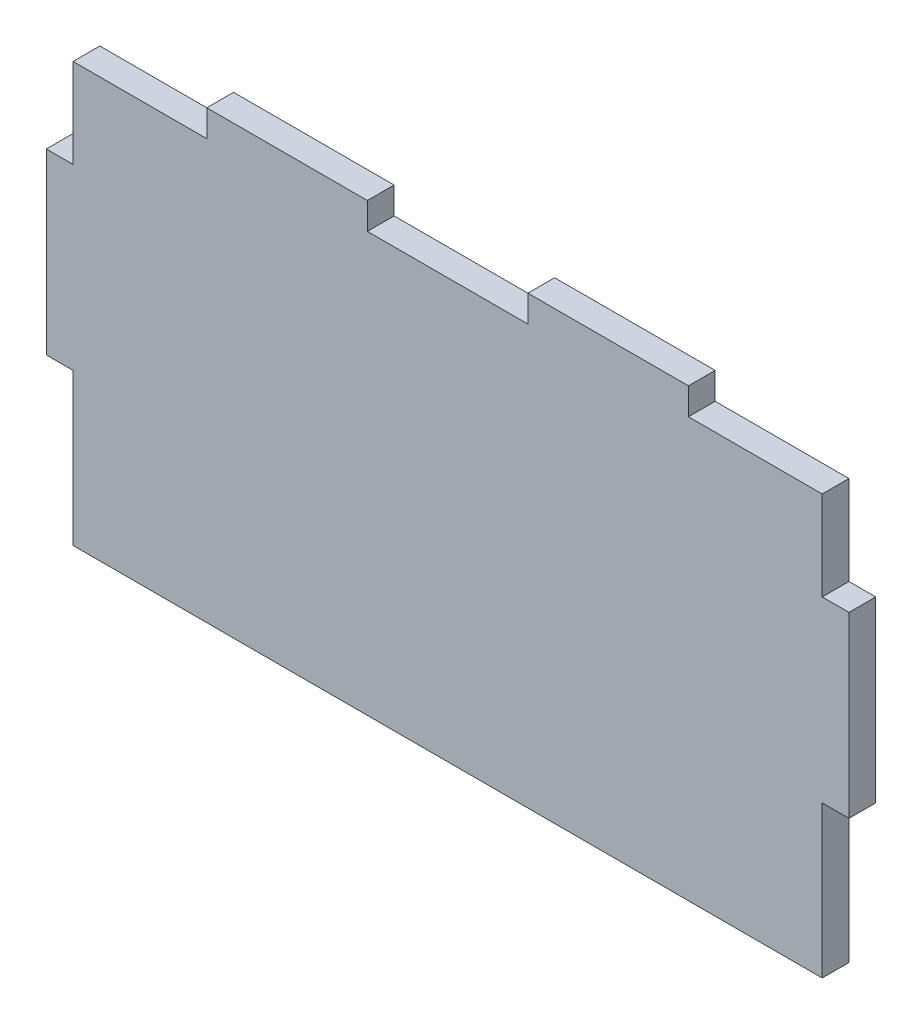
ISO-10303-21;
HEADER;
FILE_DESCRIPTION(('STEP AP214'),'2;1');
FILE_NAME('part.step','',(''),(''),'','','');
FILE_SCHEMA(('AUTOMOTIVE_DESIGN { 1 0 10303 214 1 1 1 1 }'));
ENDSEC;
DATA;
#1=APPLICATION_CONTEXT('core data for automotive mechanical design processes');
#2=APPLICATION_PROTOCOL_DEFINITION('international standard','automotive_design',2000,#1);
#3=PRODUCT_CONTEXT('',#1,'mechanical');
#4=PRODUCT('Part','Part','',(#3));
#5=PRODUCT_RELATED_PRODUCT_CATEGORY('part','',(#4));
#6=PRODUCT_DEFINITION_FORMATION('','',#4);
#7=PRODUCT_DEFINITION_CONTEXT('part definition',#1,'design');
#8=PRODUCT_DEFINITION('design','',#6,#7);
#9=PRODUCT_DEFINITION_SHAPE('','',#8);
#10=(LENGTH_UNIT() NAMED_UNIT(*) SI_UNIT(.MILLI.,.METRE.));
#11=(NAMED_UNIT(*) PLANE_ANGLE_UNIT() SI_UNIT($,.RADIAN.));
#12=(NAMED_UNIT(*) SI_UNIT($,.STERADIAN.) SOLID_ANGLE_UNIT());
#13=UNCERTAINTY_MEASURE_WITH_UNIT(LENGTH_MEASURE(1.E-05),#10,'distance_accuracy_value','');
#14=(GEOMETRIC_REPRESENTATION_CONTEXT(3) GLOBAL_UNCERTAINTY_ASSIGNED_CONTEXT((#13)) GLOBAL_UNIT_ASSIGNED_CONTEXT((#10,
#11,#12)) REPRESENTATION_CONTEXT('',''));
#15=CARTESIAN_POINT('',(0.,0.,0.));
#16=DIRECTION('',(0.,0.,1.));
#17=DIRECTION('',(1.,0.,0.));
#18=AXIS2_PLACEMENT_3D('',#15,#16,#17);
#19=CARTESIAN_POINT('',(0.,50.,3.));
#20=DIRECTION('',(0.,-1.,0.));
#21=DIRECTION('',(0.,0.,-1.));
#22=AXIS2_PLACEMENT_3D('',#19,#20,#21);
#23=PLANE('',#22);
#24=DIRECTION('',(-1.,0.,0.));
#25=VECTOR('',#24,1.);
#26=CARTESIAN_POINT('',(0.,50.,3.));
#27=LINE('',#26,#25);
#28=CARTESIAN_POINT('',(36.,50.,3.));
#29=VERTEX_POINT('',#28);
#30=CARTESIAN_POINT('',(18.,50.,3.));
#31=VERTEX_POINT('',#30);
#32=EDGE_CURVE('E42',#29,#31,#27,.T.);
#33=ORIENTED_EDGE('',*,*,#32,.F.);
#34=DIRECTION('',(0.,0.,1.));
#35=VECTOR('',#34,1.);
#36=CARTESIAN_POINT('',(36.,50.,0.));
#37=LINE('',#36,#35);
#38=CARTESIAN_POINT('',(36.,50.,0.));
#39=VERTEX_POINT('',#38);
#40=EDGE_CURVE('E201',#39,#29,#37,.T.);
#41=ORIENTED_EDGE('',*,*,#40,.F.);
#42=DIRECTION('',(-1.,0.,0.));
#43=VECTOR('',#42,1.);
#44=CARTESIAN_POINT('',(0.,50.,0.));
#45=LINE('',#44,#43);
#46=CARTESIAN_POINT('',(18.,50.,0.));
#47=VERTEX_POINT('',#46);
#48=EDGE_CURVE('E37',#39,#47,#45,.T.);
#49=ORIENTED_EDGE('',*,*,#48,.T.);
#50=DIRECTION('',(0.,0.,1.));
#51=VECTOR('',#50,1.);
#52=CARTESIAN_POINT('',(18.,50.,0.));
#53=LINE('',#52,#51);
#54=EDGE_CURVE('E298',#47,#31,#53,.T.);
#55=ORIENTED_EDGE('',*,*,#54,.T.);
#56=EDGE_LOOP('',(#33,#41,#49,#55));
#57=FACE_BOUND('',#56,.T.);
#58=ADVANCED_FACE('F33',(#57),#23,.F.);
#59=CARTESIAN_POINT('',(0.,0.,3.));
#60=DIRECTION('',(1.,0.,0.));
#61=DIRECTION('',(0.,0.,-1.));
#62=AXIS2_PLACEMENT_3D('',#59,#60,#61);
#63=PLANE('',#62);
#64=DIRECTION('',(0.,-1.,0.));
#65=VECTOR('',#64,1.);
#66=CARTESIAN_POINT('',(0.,0.,0.));
#67=LINE('',#66,#65);
#68=CARTESIAN_POINT('',(0.,37.,0.));
#69=VERTEX_POINT('',#68);
#70=CARTESIAN_POINT('',(0.,17.,0.));
#71=VERTEX_POINT('',#70);
#72=EDGE_CURVE('E301',#69,#71,#67,.T.);
#73=ORIENTED_EDGE('',*,*,#72,.T.);
#74=DIRECTION('',(0.,0.,1.));
#75=VECTOR('',#74,1.);
#76=CARTESIAN_POINT('',(0.,17.,0.));
#77=LINE('',#76,#75);
#78=CARTESIAN_POINT('',(0.,17.,3.));
#79=VERTEX_POINT('',#78);
#80=EDGE_CURVE('E251',#71,#79,#77,.T.);
#81=ORIENTED_EDGE('',*,*,#80,.T.);
#82=DIRECTION('',(0.,-1.,0.));
#83=VECTOR('',#82,1.);
#84=CARTESIAN_POINT('',(0.,0.,3.));
#85=LINE('',#84,#83);
#86=CARTESIAN_POINT('',(0.,37.,3.));
#87=VERTEX_POINT('',#86);
#88=EDGE_CURVE('E309',#87,#79,#85,.T.);
#89=ORIENTED_EDGE('',*,*,#88,.F.);
#90=DIRECTION('',(0.,0.,1.));
#91=VECTOR('',#90,1.);
#92=CARTESIAN_POINT('',(0.,37.,0.));
#93=LINE('',#92,#91);
#94=EDGE_CURVE('E287',#69,#87,#93,.T.);
#95=ORIENTED_EDGE('',*,*,#94,.F.);
#96=EDGE_LOOP('',(#73,#81,#89,#95));
#97=FACE_BOUND('',#96,.T.);
#98=ADVANCED_FACE('F35',(#97),#63,.F.);
#99=CARTESIAN_POINT('',(0.,0.,3.));
#100=DIRECTION('',(0.,1.,0.));
#101=DIRECTION('',(0.,0.,1.));
#102=AXIS2_PLACEMENT_3D('',#99,#100,#101);
#103=PLANE('',#102);
#104=DIRECTION('',(1.,0.,0.));
#105=VECTOR('',#104,1.);
#106=CARTESIAN_POINT('',(0.,0.,0.));
#107=LINE('',#106,#105);
#108=CARTESIAN_POINT('',(3.,0.,0.));
#109=VERTEX_POINT('',#108);
#110=CARTESIAN_POINT('',(87.,0.,0.));
#111=VERTEX_POINT('',#110);
#112=EDGE_CURVE('E321',#109,#111,#107,.T.);
#113=ORIENTED_EDGE('',*,*,#112,.T.);
#114=DIRECTION('',(0.,0.,1.));
#115=VECTOR('',#114,1.);
#116=CARTESIAN_POINT('',(87.,0.,0.));
#117=LINE('',#116,#115);
#118=CARTESIAN_POINT('',(87.,0.,3.));
#119=VERTEX_POINT('',#118);
#120=EDGE_CURVE('E224',#111,#119,#117,.T.);
#121=ORIENTED_EDGE('',*,*,#120,.T.);
#122=DIRECTION('',(1.,0.,0.));
#123=VECTOR('',#122,1.);
#124=CARTESIAN_POINT('',(0.,0.,3.));
#125=LINE('',#124,#123);
#126=CARTESIAN_POINT('',(3.,0.,3.));
#127=VERTEX_POINT('',#126);
#128=EDGE_CURVE('E312',#127,#119,#125,.T.);
#129=ORIENTED_EDGE('',*,*,#128,.F.);
#130=DIRECTION('',(0.,0.,1.));
#131=VECTOR('',#130,1.);
#132=CARTESIAN_POINT('',(3.,0.,0.));
#133=LINE('',#132,#131);
#134=EDGE_CURVE('E265',#109,#127,#133,.T.);
#135=ORIENTED_EDGE('',*,*,#134,.F.);
#136=EDGE_LOOP('',(#113,#121,#129,#135));
#137=FACE_BOUND('',#136,.T.);
#138=ADVANCED_FACE('F362',(#137),#103,.F.);
#139=CARTESIAN_POINT('',(90.,0.,3.));
#140=DIRECTION('',(-1.,0.,0.));
#141=DIRECTION('',(0.,0.,1.));
#142=AXIS2_PLACEMENT_3D('',#139,#140,#141);
#143=PLANE('',#142);
#144=DIRECTION('',(0.,1.,0.));
#145=VECTOR('',#144,1.);
#146=CARTESIAN_POINT('',(90.,0.,0.));
#147=LINE('',#146,#145);
#148=CARTESIAN_POINT('',(90.,17.,0.));
#149=VERTEX_POINT('',#148);
#150=CARTESIAN_POINT('',(90.,37.,0.));
#151=VERTEX_POINT('',#150);
#152=EDGE_CURVE('E323',#149,#151,#147,.T.);
#153=ORIENTED_EDGE('',*,*,#152,.T.);
#154=DIRECTION('',(0.,0.,1.));
#155=VECTOR('',#154,1.);
#156=CARTESIAN_POINT('',(90.,37.,0.));
#157=LINE('',#156,#155);
#158=CARTESIAN_POINT('',(90.,37.,3.));
#159=VERTEX_POINT('',#158);
#160=EDGE_CURVE('E199',#151,#159,#157,.T.);
#161=ORIENTED_EDGE('',*,*,#160,.T.);
#162=DIRECTION('',(0.,1.,0.));
#163=VECTOR('',#162,1.);
#164=CARTESIAN_POINT('',(90.,0.,3.));
#165=LINE('',#164,#163);
#166=CARTESIAN_POINT('',(90.,17.,3.));
#167=VERTEX_POINT('',#166);
#168=EDGE_CURVE('E316',#167,#159,#165,.T.);
#169=ORIENTED_EDGE('',*,*,#168,.F.);
#170=DIRECTION('',(0.,0.,1.));
#171=VECTOR('',#170,1.);
#172=CARTESIAN_POINT('',(90.,17.,0.));
#173=LINE('',#172,#171);
#174=EDGE_CURVE('E247',#149,#167,#173,.T.);
#175=ORIENTED_EDGE('',*,*,#174,.F.);
#176=EDGE_LOOP('',(#153,#161,#169,#175));
#177=FACE_BOUND('',#176,.T.);
#178=ADVANCED_FACE('F352',(#177),#143,.F.);
#179=CARTESIAN_POINT('',(72.,50.,0.));
#180=VERTEX_POINT('',#179);
#181=CARTESIAN_POINT('',(54.,50.,0.));
#182=VERTEX_POINT('',#181);
#183=EDGE_CURVE('E313',#180,#182,#45,.T.);
#184=ORIENTED_EDGE('',*,*,#183,.T.);
#185=DIRECTION('',(0.,0.,1.));
#186=VECTOR('',#185,1.);
#187=CARTESIAN_POINT('',(54.,50.,0.));
#188=LINE('',#187,#186);
#189=CARTESIAN_POINT('',(54.,50.,3.));
#190=VERTEX_POINT('',#189);
#191=EDGE_CURVE('E204',#182,#190,#188,.T.);
#192=ORIENTED_EDGE('',*,*,#191,.T.);
#193=CARTESIAN_POINT('',(72.,50.,3.));
#194=VERTEX_POINT('',#193);
#195=EDGE_CURVE('E11',#194,#190,#27,.T.);
#196=ORIENTED_EDGE('',*,*,#195,.F.);
#197=DIRECTION('',(0.,0.,1.));
#198=VECTOR('',#197,1.);
#199=CARTESIAN_POINT('',(72.,50.,0.));
#200=LINE('',#199,#198);
#201=EDGE_CURVE('E219',#180,#194,#200,.T.);
#202=ORIENTED_EDGE('',*,*,#201,.F.);
#203=EDGE_LOOP('',(#184,#192,#196,#202));
#204=FACE_BOUND('',#203,.T.);
#205=ADVANCED_FACE('F334',(#204),#23,.F.);
#206=CARTESIAN_POINT('',(0.,0.,3.));
#207=DIRECTION('',(0.,0.,-1.));
#208=DIRECTION('',(-1.,0.,0.));
#209=AXIS2_PLACEMENT_3D('',#206,#207,#208);
#210=PLANE('',#209);
#211=DIRECTION('',(1.,0.,0.));
#212=VECTOR('',#211,1.);
#213=CARTESIAN_POINT('',(36.,47.,3.));
#214=LINE('',#213,#212);
#215=CARTESIAN_POINT('',(36.,47.,3.));
#216=VERTEX_POINT('',#215);
#217=CARTESIAN_POINT('',(54.,47.,3.));
#218=VERTEX_POINT('',#217);
#219=EDGE_CURVE('E194',#216,#218,#214,.T.);
#220=ORIENTED_EDGE('',*,*,#219,.F.);
#221=DIRECTION('',(0.,-1.,0.));
#222=VECTOR('',#221,1.);
#223=CARTESIAN_POINT('',(36.,50.,3.));
#224=LINE('',#223,#222);
#225=EDGE_CURVE('E178',#29,#216,#224,.T.);
#226=ORIENTED_EDGE('',*,*,#225,.F.);
#227=ORIENTED_EDGE('',*,*,#32,.T.);
#228=DIRECTION('',(0.,1.,0.));
#229=VECTOR('',#228,1.);
#230=CARTESIAN_POINT('',(18.,50.,3.));
#231=LINE('',#230,#229);
#232=CARTESIAN_POINT('',(18.,47.,3.));
#233=VERTEX_POINT('',#232);
#234=EDGE_CURVE('E279',#233,#31,#231,.T.);
#235=ORIENTED_EDGE('',*,*,#234,.F.);
#236=DIRECTION('',(1.,0.,0.));
#237=VECTOR('',#236,1.);
#238=CARTESIAN_POINT('',(18.,47.,3.));
#239=LINE('',#238,#237);
#240=CARTESIAN_POINT('',(3.,47.,3.));
#241=VERTEX_POINT('',#240);
#242=EDGE_CURVE('E293',#241,#233,#239,.T.);
#243=ORIENTED_EDGE('',*,*,#242,.F.);
#244=DIRECTION('',(0.,1.,0.));
#245=VECTOR('',#244,1.);
#246=CARTESIAN_POINT('',(3.,47.,3.));
#247=LINE('',#246,#245);
#248=CARTESIAN_POINT('',(3.,37.,3.));
#249=VERTEX_POINT('',#248);
#250=EDGE_CURVE('E290',#249,#241,#247,.T.);
#251=ORIENTED_EDGE('',*,*,#250,.F.);
#252=DIRECTION('',(1.,0.,0.));
#253=VECTOR('',#252,1.);
#254=CARTESIAN_POINT('',(0.,37.,3.));
#255=LINE('',#254,#253);
#256=EDGE_CURVE('E203',#87,#249,#255,.T.);
#257=ORIENTED_EDGE('',*,*,#256,.F.);
#258=ORIENTED_EDGE('',*,*,#88,.T.);
#259=DIRECTION('',(-1.,0.,0.));
#260=VECTOR('',#259,1.);
#261=CARTESIAN_POINT('',(0.,17.,3.));
#262=LINE('',#261,#260);
#263=CARTESIAN_POINT('',(3.,17.,3.));
#264=VERTEX_POINT('',#263);
#265=EDGE_CURVE('E262',#264,#79,#262,.T.);
#266=ORIENTED_EDGE('',*,*,#265,.F.);
#267=DIRECTION('',(0.,1.,0.));
#268=VECTOR('',#267,1.);
#269=CARTESIAN_POINT('',(3.,0.,3.));
#270=LINE('',#269,#268);
#271=EDGE_CURVE('E266',#127,#264,#270,.T.);
#272=ORIENTED_EDGE('',*,*,#271,.F.);
#273=ORIENTED_EDGE('',*,*,#128,.T.);
#274=DIRECTION('',(0.,-1.,0.));
#275=VECTOR('',#274,1.);
#276=CARTESIAN_POINT('',(87.,17.,3.));
#277=LINE('',#276,#275);
#278=CARTESIAN_POINT('',(87.,17.,3.));
#279=VERTEX_POINT('',#278);
#280=EDGE_CURVE('E244',#279,#119,#277,.T.);
#281=ORIENTED_EDGE('',*,*,#280,.F.);
#282=DIRECTION('',(-1.,0.,0.));
#283=VECTOR('',#282,1.);
#284=CARTESIAN_POINT('',(90.,17.,3.));
#285=LINE('',#284,#283);
#286=EDGE_CURVE('E248',#167,#279,#285,.T.);
#287=ORIENTED_EDGE('',*,*,#286,.F.);
#288=ORIENTED_EDGE('',*,*,#168,.T.);
#289=DIRECTION('',(1.,0.,0.));
#290=VECTOR('',#289,1.);
#291=CARTESIAN_POINT('',(90.,37.,3.));
#292=LINE('',#291,#290);
#293=CARTESIAN_POINT('',(87.,37.,3.));
#294=VERTEX_POINT('',#293);
#295=EDGE_CURVE('E211',#294,#159,#292,.T.);
#296=ORIENTED_EDGE('',*,*,#295,.F.);
#297=DIRECTION('',(0.,-1.,0.));
#298=VECTOR('',#297,1.);
#299=CARTESIAN_POINT('',(87.,37.,3.));
#300=LINE('',#299,#298);
#301=CARTESIAN_POINT('',(87.,47.,3.));
#302=VERTEX_POINT('',#301);
#303=EDGE_CURVE('E227',#302,#294,#300,.T.);
#304=ORIENTED_EDGE('',*,*,#303,.F.);
#305=DIRECTION('',(1.,0.,0.));
#306=VECTOR('',#305,1.);
#307=CARTESIAN_POINT('',(72.,47.,3.));
#308=LINE('',#307,#306);
#309=CARTESIAN_POINT('',(72.,47.,3.));
#310=VERTEX_POINT('',#309);
#311=EDGE_CURVE('E223',#310,#302,#308,.T.);
#312=ORIENTED_EDGE('',*,*,#311,.F.);
#313=DIRECTION('',(0.,-1.,0.));
#314=VECTOR('',#313,1.);
#315=CARTESIAN_POINT('',(72.,50.,3.));
#316=LINE('',#315,#314);
#317=EDGE_CURVE('E220',#194,#310,#316,.T.);
#318=ORIENTED_EDGE('',*,*,#317,.F.);
#319=ORIENTED_EDGE('',*,*,#195,.T.);
#320=DIRECTION('',(0.,1.,0.));
#321=VECTOR('',#320,1.);
#322=CARTESIAN_POINT('',(54.,50.,3.));
#323=LINE('',#322,#321);
#324=EDGE_CURVE('E192',#218,#190,#323,.T.);
#325=ORIENTED_EDGE('',*,*,#324,.F.);
#326=EDGE_LOOP('',(#220,#226,#227,#235,#243,#251,#257,#258,#266,#272,#273,#281,#287,#288,#296,
#304,#312,#318,#319,#325));
#327=FACE_BOUND('',#326,.T.);
#328=ADVANCED_FACE('F345',(#327),#210,.F.);
#329=CARTESIAN_POINT('',(0.,0.,0.));
#330=DIRECTION('',(0.,0.,-1.));
#331=DIRECTION('',(-1.,0.,0.));
#332=AXIS2_PLACEMENT_3D('',#329,#330,#331);
#333=PLANE('',#332);
#334=DIRECTION('',(0.,-1.,0.));
#335=VECTOR('',#334,1.);
#336=CARTESIAN_POINT('',(36.,50.,0.));
#337=LINE('',#336,#335);
#338=CARTESIAN_POINT('',(36.,47.,0.));
#339=VERTEX_POINT('',#338);
#340=EDGE_CURVE('E175',#39,#339,#337,.T.);
#341=ORIENTED_EDGE('',*,*,#340,.T.);
#342=DIRECTION('',(1.,0.,0.));
#343=VECTOR('',#342,1.);
#344=CARTESIAN_POINT('',(36.,47.,0.));
#345=LINE('',#344,#343);
#346=CARTESIAN_POINT('',(54.,47.,0.));
#347=VERTEX_POINT('',#346);
#348=EDGE_CURVE('E185',#339,#347,#345,.T.);
#349=ORIENTED_EDGE('',*,*,#348,.T.);
#350=DIRECTION('',(0.,1.,0.));
#351=VECTOR('',#350,1.);
#352=CARTESIAN_POINT('',(54.,50.,0.));
#353=LINE('',#352,#351);
#354=EDGE_CURVE('E50',#347,#182,#353,.T.);
#355=ORIENTED_EDGE('',*,*,#354,.T.);
#356=ORIENTED_EDGE('',*,*,#183,.F.);
#357=DIRECTION('',(0.,-1.,0.));
#358=VECTOR('',#357,1.);
#359=CARTESIAN_POINT('',(72.,50.,0.));
#360=LINE('',#359,#358);
#361=CARTESIAN_POINT('',(72.,47.,0.));
#362=VERTEX_POINT('',#361);
#363=EDGE_CURVE('E208',#180,#362,#360,.T.);
#364=ORIENTED_EDGE('',*,*,#363,.T.);
#365=DIRECTION('',(1.,0.,0.));
#366=VECTOR('',#365,1.);
#367=CARTESIAN_POINT('',(72.,47.,0.));
#368=LINE('',#367,#366);
#369=CARTESIAN_POINT('',(87.,47.,0.));
#370=VERTEX_POINT('',#369);
#371=EDGE_CURVE('E58',#362,#370,#368,.T.);
#372=ORIENTED_EDGE('',*,*,#371,.T.);
#373=DIRECTION('',(0.,-1.,0.));
#374=VECTOR('',#373,1.);
#375=CARTESIAN_POINT('',(87.,37.,0.));
#376=LINE('',#375,#374);
#377=CARTESIAN_POINT('',(87.,37.,0.));
#378=VERTEX_POINT('',#377);
#379=EDGE_CURVE('E213',#370,#378,#376,.T.);
#380=ORIENTED_EDGE('',*,*,#379,.T.);
#381=DIRECTION('',(1.,0.,0.));
#382=VECTOR('',#381,1.);
#383=CARTESIAN_POINT('',(90.,37.,0.));
#384=LINE('',#383,#382);
#385=EDGE_CURVE('E216',#378,#151,#384,.T.);
#386=ORIENTED_EDGE('',*,*,#385,.T.);
#387=ORIENTED_EDGE('',*,*,#152,.F.);
#388=DIRECTION('',(-1.,0.,0.));
#389=VECTOR('',#388,1.);
#390=CARTESIAN_POINT('',(90.,17.,0.));
#391=LINE('',#390,#389);
#392=CARTESIAN_POINT('',(87.,17.,0.));
#393=VERTEX_POINT('',#392);
#394=EDGE_CURVE('E240',#149,#393,#391,.T.);
#395=ORIENTED_EDGE('',*,*,#394,.T.);
#396=DIRECTION('',(0.,-1.,0.));
#397=VECTOR('',#396,1.);
#398=CARTESIAN_POINT('',(87.,17.,0.));
#399=LINE('',#398,#397);
#400=EDGE_CURVE('E243',#393,#111,#399,.T.);
#401=ORIENTED_EDGE('',*,*,#400,.T.);
#402=ORIENTED_EDGE('',*,*,#112,.F.);
#403=DIRECTION('',(0.,1.,0.));
#404=VECTOR('',#403,1.);
#405=CARTESIAN_POINT('',(3.,0.,0.));
#406=LINE('',#405,#404);
#407=CARTESIAN_POINT('',(3.,17.,0.));
#408=VERTEX_POINT('',#407);
#409=EDGE_CURVE('E258',#109,#408,#406,.T.);
#410=ORIENTED_EDGE('',*,*,#409,.T.);
#411=DIRECTION('',(-1.,0.,0.));
#412=VECTOR('',#411,1.);
#413=CARTESIAN_POINT('',(0.,17.,0.));
#414=LINE('',#413,#412);
#415=EDGE_CURVE('E261',#408,#71,#414,.T.);
#416=ORIENTED_EDGE('',*,*,#415,.T.);
#417=ORIENTED_EDGE('',*,*,#72,.F.);
#418=DIRECTION('',(1.,0.,0.));
#419=VECTOR('',#418,1.);
#420=CARTESIAN_POINT('',(0.,37.,0.));
#421=LINE('',#420,#419);
#422=CARTESIAN_POINT('',(3.,37.,0.));
#423=VERTEX_POINT('',#422);
#424=EDGE_CURVE('E275',#69,#423,#421,.T.);
#425=ORIENTED_EDGE('',*,*,#424,.T.);
#426=DIRECTION('',(0.,1.,0.));
#427=VECTOR('',#426,1.);
#428=CARTESIAN_POINT('',(3.,47.,0.));
#429=LINE('',#428,#427);
#430=CARTESIAN_POINT('',(3.,47.,0.));
#431=VERTEX_POINT('',#430);
#432=EDGE_CURVE('E278',#423,#431,#429,.T.);
#433=ORIENTED_EDGE('',*,*,#432,.T.);
#434=DIRECTION('',(1.,0.,0.));
#435=VECTOR('',#434,1.);
#436=CARTESIAN_POINT('',(18.,47.,0.));
#437=LINE('',#436,#435);
#438=CARTESIAN_POINT('',(18.,47.,0.));
#439=VERTEX_POINT('',#438);
#440=EDGE_CURVE('E282',#431,#439,#437,.T.);
#441=ORIENTED_EDGE('',*,*,#440,.T.);
#442=DIRECTION('',(0.,1.,0.));
#443=VECTOR('',#442,1.);
#444=CARTESIAN_POINT('',(18.,50.,0.));
#445=LINE('',#444,#443);
#446=EDGE_CURVE('E285',#439,#47,#445,.T.);
#447=ORIENTED_EDGE('',*,*,#446,.T.);
#448=ORIENTED_EDGE('',*,*,#48,.F.);
#449=EDGE_LOOP('',(#341,#349,#355,#356,#364,#372,#380,#386,#387,#395,#401,#402,#410,#416,#417,
#425,#433,#441,#447,#448));
#450=FACE_BOUND('',#449,.T.);
#451=ADVANCED_FACE('F190',(#450),#333,.T.);
#452=CARTESIAN_POINT('',(18.,50.,0.));
#453=DIRECTION('',(1.,0.,0.));
#454=DIRECTION('',(0.,0.,-1.));
#455=AXIS2_PLACEMENT_3D('',#452,#453,#454);
#456=PLANE('',#455);
#457=ORIENTED_EDGE('',*,*,#234,.T.);
#458=ORIENTED_EDGE('',*,*,#54,.F.);
#459=ORIENTED_EDGE('',*,*,#446,.F.);
#460=DIRECTION('',(0.,0.,1.));
#461=VECTOR('',#460,1.);
#462=CARTESIAN_POINT('',(18.,47.,0.));
#463=LINE('',#462,#461);
#464=EDGE_CURVE('E302',#439,#233,#463,.T.);
#465=ORIENTED_EDGE('',*,*,#464,.T.);
#466=EDGE_LOOP('',(#457,#458,#459,#465));
#467=FACE_BOUND('',#466,.T.);
#468=ADVANCED_FACE('F388',(#467),#456,.F.);
#469=CARTESIAN_POINT('',(18.,47.,0.));
#470=DIRECTION('',(0.,-1.,0.));
#471=DIRECTION('',(0.,0.,-1.));
#472=AXIS2_PLACEMENT_3D('',#469,#470,#471);
#473=PLANE('',#472);
#474=ORIENTED_EDGE('',*,*,#242,.T.);
#475=ORIENTED_EDGE('',*,*,#464,.F.);
#476=ORIENTED_EDGE('',*,*,#440,.F.);
#477=DIRECTION('',(0.,0.,1.));
#478=VECTOR('',#477,1.);
#479=CARTESIAN_POINT('',(3.,47.,0.));
#480=LINE('',#479,#478);
#481=EDGE_CURVE('E304',#431,#241,#480,.T.);
#482=ORIENTED_EDGE('',*,*,#481,.T.);
#483=EDGE_LOOP('',(#474,#475,#476,#482));
#484=FACE_BOUND('',#483,.T.);
#485=ADVANCED_FACE('F385',(#484),#473,.F.);
#486=CARTESIAN_POINT('',(3.,47.,0.));
#487=DIRECTION('',(1.,0.,0.));
#488=DIRECTION('',(0.,1.,0.));
#489=AXIS2_PLACEMENT_3D('',#486,#487,#488);
#490=PLANE('',#489);
#491=ORIENTED_EDGE('',*,*,#250,.T.);
#492=ORIENTED_EDGE('',*,*,#481,.F.);
#493=ORIENTED_EDGE('',*,*,#432,.F.);
#494=DIRECTION('',(0.,0.,1.));
#495=VECTOR('',#494,1.);
#496=CARTESIAN_POINT('',(3.,37.,0.));
#497=LINE('',#496,#495);
#498=EDGE_CURVE('E306',#423,#249,#497,.T.);
#499=ORIENTED_EDGE('',*,*,#498,.T.);
#500=EDGE_LOOP('',(#491,#492,#493,#499));
#501=FACE_BOUND('',#500,.T.);
#502=ADVANCED_FACE('F381',(#501),#490,.F.);
#503=CARTESIAN_POINT('',(0.,37.,0.));
#504=DIRECTION('',(0.,-1.,0.));
#505=DIRECTION('',(0.,0.,-1.));
#506=AXIS2_PLACEMENT_3D('',#503,#504,#505);
#507=PLANE('',#506);
#508=ORIENTED_EDGE('',*,*,#256,.T.);
#509=ORIENTED_EDGE('',*,*,#498,.F.);
#510=ORIENTED_EDGE('',*,*,#424,.F.);
#511=ORIENTED_EDGE('',*,*,#94,.T.);
#512=EDGE_LOOP('',(#508,#509,#510,#511));
#513=FACE_BOUND('',#512,.T.);
#514=ADVANCED_FACE('F378',(#513),#507,.F.);
#515=CARTESIAN_POINT('',(0.,17.,0.));
#516=DIRECTION('',(0.,1.,0.));
#517=DIRECTION('',(0.,0.,1.));
#518=AXIS2_PLACEMENT_3D('',#515,#516,#517);
#519=PLANE('',#518);
#520=ORIENTED_EDGE('',*,*,#265,.T.);
#521=ORIENTED_EDGE('',*,*,#80,.F.);
#522=ORIENTED_EDGE('',*,*,#415,.F.);
#523=DIRECTION('',(0.,0.,1.));
#524=VECTOR('',#523,1.);
#525=CARTESIAN_POINT('',(3.,17.,0.));
#526=LINE('',#525,#524);
#527=EDGE_CURVE('E272',#408,#264,#526,.T.);
#528=ORIENTED_EDGE('',*,*,#527,.T.);
#529=EDGE_LOOP('',(#520,#521,#522,#528));
#530=FACE_BOUND('',#529,.T.);
#531=ADVANCED_FACE('F372',(#530),#519,.F.);
#532=CARTESIAN_POINT('',(3.,0.,0.));
#533=DIRECTION('',(1.,0.,0.));
#534=DIRECTION('',(0.,0.,-1.));
#535=AXIS2_PLACEMENT_3D('',#532,#533,#534);
#536=PLANE('',#535);
#537=ORIENTED_EDGE('',*,*,#271,.T.);
#538=ORIENTED_EDGE('',*,*,#527,.F.);
#539=ORIENTED_EDGE('',*,*,#409,.F.);
#540=ORIENTED_EDGE('',*,*,#134,.T.);
#541=EDGE_LOOP('',(#537,#538,#539,#540));
#542=FACE_BOUND('',#541,.T.);
#543=ADVANCED_FACE('F366',(#542),#536,.F.);
#544=CARTESIAN_POINT('',(87.,17.,0.));
#545=DIRECTION('',(-1.,0.,0.));
#546=DIRECTION('',(0.,0.,1.));
#547=AXIS2_PLACEMENT_3D('',#544,#545,#546);
#548=PLANE('',#547);
#549=ORIENTED_EDGE('',*,*,#280,.T.);
#550=ORIENTED_EDGE('',*,*,#120,.F.);
#551=ORIENTED_EDGE('',*,*,#400,.F.);
#552=DIRECTION('',(0.,0.,1.));
#553=VECTOR('',#552,1.);
#554=CARTESIAN_POINT('',(87.,17.,0.));
#555=LINE('',#554,#553);
#556=EDGE_CURVE('E255',#393,#279,#555,.T.);
#557=ORIENTED_EDGE('',*,*,#556,.T.);
#558=EDGE_LOOP('',(#549,#550,#551,#557));
#559=FACE_BOUND('',#558,.T.);
#560=ADVANCED_FACE('F477',(#559),#548,.F.);
#561=CARTESIAN_POINT('',(90.,17.,0.));
#562=DIRECTION('',(0.,1.,0.));
#563=DIRECTION('',(0.,0.,1.));
#564=AXIS2_PLACEMENT_3D('',#561,#562,#563);
#565=PLANE('',#564);
#566=ORIENTED_EDGE('',*,*,#286,.T.);
#567=ORIENTED_EDGE('',*,*,#556,.F.);
#568=ORIENTED_EDGE('',*,*,#394,.F.);
#569=ORIENTED_EDGE('',*,*,#174,.T.);
#570=EDGE_LOOP('',(#566,#567,#568,#569));
#571=FACE_BOUND('',#570,.T.);
#572=ADVANCED_FACE('F357',(#571),#565,.F.);
#573=CARTESIAN_POINT('',(90.,37.,0.));
#574=DIRECTION('',(0.,-1.,0.));
#575=DIRECTION('',(0.,0.,-1.));
#576=AXIS2_PLACEMENT_3D('',#573,#574,#575);
#577=PLANE('',#576);
#578=ORIENTED_EDGE('',*,*,#295,.T.);
#579=ORIENTED_EDGE('',*,*,#160,.F.);
#580=ORIENTED_EDGE('',*,*,#385,.F.);
#581=DIRECTION('',(0.,0.,1.));
#582=VECTOR('',#581,1.);
#583=CARTESIAN_POINT('',(87.,37.,0.));
#584=LINE('',#583,#582);
#585=EDGE_CURVE('E233',#378,#294,#584,.T.);
#586=ORIENTED_EDGE('',*,*,#585,.T.);
#587=EDGE_LOOP('',(#578,#579,#580,#586));
#588=FACE_BOUND('',#587,.T.);
#589=ADVANCED_FACE('F350',(#588),#577,.F.);
#590=CARTESIAN_POINT('',(87.,37.,0.));
#591=DIRECTION('',(-1.,0.,0.));
#592=DIRECTION('',(0.,0.,1.));
#593=AXIS2_PLACEMENT_3D('',#590,#591,#592);
#594=PLANE('',#593);
#595=ORIENTED_EDGE('',*,*,#303,.T.);
#596=ORIENTED_EDGE('',*,*,#585,.F.);
#597=ORIENTED_EDGE('',*,*,#379,.F.);
#598=DIRECTION('',(0.,0.,1.));
#599=VECTOR('',#598,1.);
#600=CARTESIAN_POINT('',(87.,47.,0.));
#601=LINE('',#600,#599);
#602=EDGE_CURVE('E235',#370,#302,#601,.T.);
#603=ORIENTED_EDGE('',*,*,#602,.T.);
#604=EDGE_LOOP('',(#595,#596,#597,#603));
#605=FACE_BOUND('',#604,.T.);
#606=ADVANCED_FACE('F347',(#605),#594,.F.);
#607=CARTESIAN_POINT('',(72.,47.,0.));
#608=DIRECTION('',(0.,-1.,0.));
#609=DIRECTION('',(0.,0.,-1.));
#610=AXIS2_PLACEMENT_3D('',#607,#608,#609);
#611=PLANE('',#610);
#612=ORIENTED_EDGE('',*,*,#311,.T.);
#613=ORIENTED_EDGE('',*,*,#602,.F.);
#614=ORIENTED_EDGE('',*,*,#371,.F.);
#615=DIRECTION('',(0.,0.,1.));
#616=VECTOR('',#615,1.);
#617=CARTESIAN_POINT('',(72.,47.,0.));
#618=LINE('',#617,#616);
#619=EDGE_CURVE('E237',#362,#310,#618,.T.);
#620=ORIENTED_EDGE('',*,*,#619,.T.);
#621=EDGE_LOOP('',(#612,#613,#614,#620));
#622=FACE_BOUND('',#621,.T.);
#623=ADVANCED_FACE('F340',(#622),#611,.F.);
#624=CARTESIAN_POINT('',(72.,50.,0.));
#625=DIRECTION('',(-1.,0.,0.));
#626=DIRECTION('',(0.,0.,1.));
#627=AXIS2_PLACEMENT_3D('',#624,#625,#626);
#628=PLANE('',#627);
#629=ORIENTED_EDGE('',*,*,#317,.T.);
#630=ORIENTED_EDGE('',*,*,#619,.F.);
#631=ORIENTED_EDGE('',*,*,#363,.F.);
#632=ORIENTED_EDGE('',*,*,#201,.T.);
#633=EDGE_LOOP('',(#629,#630,#631,#632));
#634=FACE_BOUND('',#633,.T.);
#635=ADVANCED_FACE('F337',(#634),#628,.F.);
#636=CARTESIAN_POINT('',(36.,50.,0.));
#637=DIRECTION('',(-1.,0.,0.));
#638=DIRECTION('',(0.,-1.,0.));
#639=AXIS2_PLACEMENT_3D('',#636,#637,#638);
#640=PLANE('',#639);
#641=ORIENTED_EDGE('',*,*,#225,.T.);
#642=DIRECTION('',(0.,0.,1.));
#643=VECTOR('',#642,1.);
#644=CARTESIAN_POINT('',(36.,47.,0.));
#645=LINE('',#644,#643);
#646=EDGE_CURVE('E171',#339,#216,#645,.T.);
#647=ORIENTED_EDGE('',*,*,#646,.F.);
#648=ORIENTED_EDGE('',*,*,#340,.F.);
#649=ORIENTED_EDGE('',*,*,#40,.T.);
#650=EDGE_LOOP('',(#641,#647,#648,#649));
#651=FACE_BOUND('',#650,.T.);
#652=ADVANCED_FACE('F173',(#651),#640,.F.);
#653=CARTESIAN_POINT('',(54.,50.,0.));
#654=DIRECTION('',(1.,0.,0.));
#655=DIRECTION('',(0.,0.,-1.));
#656=AXIS2_PLACEMENT_3D('',#653,#654,#655);
#657=PLANE('',#656);
#658=ORIENTED_EDGE('',*,*,#324,.T.);
#659=ORIENTED_EDGE('',*,*,#191,.F.);
#660=ORIENTED_EDGE('',*,*,#354,.F.);
#661=DIRECTION('',(0.,0.,1.));
#662=VECTOR('',#661,1.);
#663=CARTESIAN_POINT('',(54.,47.,0.));
#664=LINE('',#663,#662);
#665=EDGE_CURVE('E182',#347,#218,#664,.T.);
#666=ORIENTED_EDGE('',*,*,#665,.T.);
#667=EDGE_LOOP('',(#658,#659,#660,#666));
#668=FACE_BOUND('',#667,.T.);
#669=ADVANCED_FACE('F392',(#668),#657,.F.);
#670=CARTESIAN_POINT('',(36.,47.,0.));
#671=DIRECTION('',(0.,-1.,0.));
#672=DIRECTION('',(0.,0.,-1.));
#673=AXIS2_PLACEMENT_3D('',#670,#671,#672);
#674=PLANE('',#673);
#675=ORIENTED_EDGE('',*,*,#219,.T.);
#676=ORIENTED_EDGE('',*,*,#665,.F.);
#677=ORIENTED_EDGE('',*,*,#348,.F.);
#678=ORIENTED_EDGE('',*,*,#646,.T.);
#679=EDGE_LOOP('',(#675,#676,#677,#678));
#680=FACE_BOUND('',#679,.T.);
#681=ADVANCED_FACE('F186',(#680),#674,.F.);
#682=CLOSED_SHELL('',(#58,#98,#138,#178,#205,#328,#451,#468,#485,#502,#514,#531,#543,#560,#572,
#589,#606,#623,#635,#652,#669,#681));
#683=MANIFOLD_SOLID_BREP('B2',#682);
#684=ADVANCED_BREP_SHAPE_REPRESENTATION('',(#18,#683),#14);
#685=SHAPE_DEFINITION_REPRESENTATION(#9,#684);
ENDSEC;
END-ISO-10303-21;
